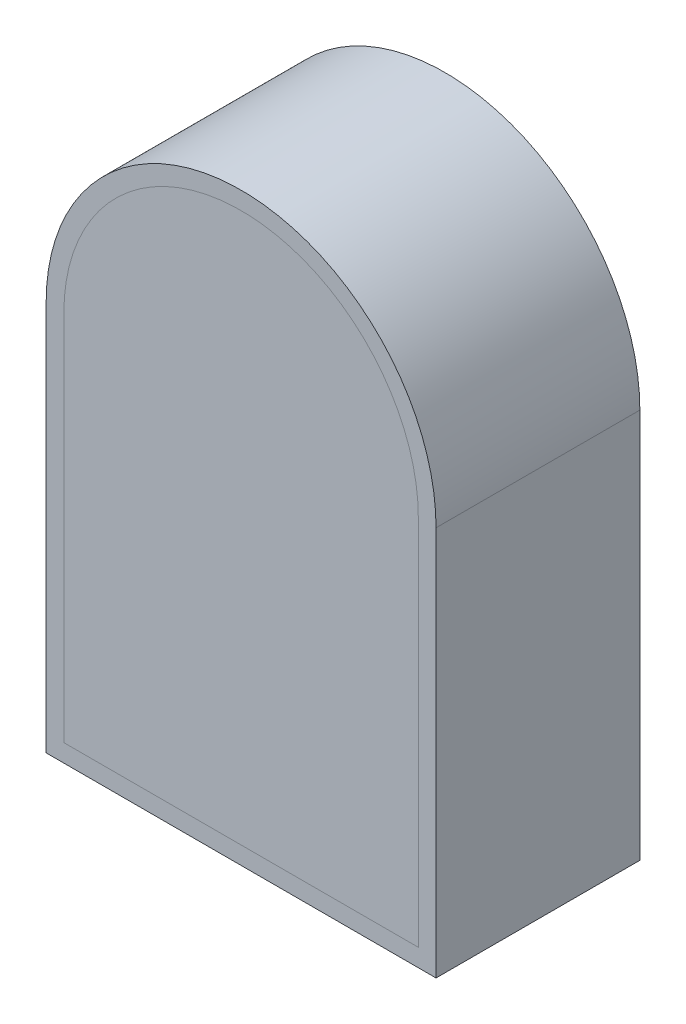
ISO-10303-21;
HEADER;
FILE_DESCRIPTION(('STEP AP214'),'2;1');
FILE_NAME('part.step','',(''),(''),'','','');
FILE_SCHEMA(('AUTOMOTIVE_DESIGN { 1 0 10303 214 1 1 1 1 }'));
ENDSEC;
DATA;
#1=APPLICATION_CONTEXT('core data for automotive mechanical design processes');
#2=APPLICATION_PROTOCOL_DEFINITION('international standard','automotive_design',2000,#1);
#3=PRODUCT_CONTEXT('',#1,'mechanical');
#4=PRODUCT('Part','Part','',(#3));
#5=PRODUCT_RELATED_PRODUCT_CATEGORY('part','',(#4));
#6=PRODUCT_DEFINITION_FORMATION('','',#4);
#7=PRODUCT_DEFINITION_CONTEXT('part definition',#1,'design');
#8=PRODUCT_DEFINITION('design','',#6,#7);
#9=PRODUCT_DEFINITION_SHAPE('','',#8);
#10=(LENGTH_UNIT() NAMED_UNIT(*) SI_UNIT(.MILLI.,.METRE.));
#11=(NAMED_UNIT(*) PLANE_ANGLE_UNIT() SI_UNIT($,.RADIAN.));
#12=(NAMED_UNIT(*) SI_UNIT($,.STERADIAN.) SOLID_ANGLE_UNIT());
#13=UNCERTAINTY_MEASURE_WITH_UNIT(LENGTH_MEASURE(1.E-05),#10,'distance_accuracy_value','');
#14=(GEOMETRIC_REPRESENTATION_CONTEXT(3) GLOBAL_UNCERTAINTY_ASSIGNED_CONTEXT((#13)) GLOBAL_UNIT_ASSIGNED_CONTEXT((#10,
#11,#12)) REPRESENTATION_CONTEXT('',''));
#15=CARTESIAN_POINT('',(0.,0.,0.));
#16=DIRECTION('',(0.,0.,1.));
#17=DIRECTION('',(1.,0.,0.));
#18=AXIS2_PLACEMENT_3D('',#15,#16,#17);
#19=CARTESIAN_POINT('',(10.,22.,11.5));
#20=DIRECTION('',(0.,0.,1.));
#21=DIRECTION('',(-1.,0.,0.));
#22=AXIS2_PLACEMENT_3D('',#19,#20,#21);
#23=PLANE('',#22);
#24=CARTESIAN_POINT('',(0.,22.,11.5));
#25=DIRECTION('',(0.,0.,1.));
#26=DIRECTION('',(1.,0.,0.));
#27=AXIS2_PLACEMENT_3D('',#24,#25,#26);
#28=CIRCLE('',#27,10.);
#29=CARTESIAN_POINT('',(10.,22.,11.5));
#30=VERTEX_POINT('',#29);
#31=CARTESIAN_POINT('',(-10.,22.,11.5));
#32=VERTEX_POINT('',#31);
#33=EDGE_CURVE('E13',#30,#32,#28,.T.);
#34=ORIENTED_EDGE('',*,*,#33,.T.);
#35=DIRECTION('',(0.,-1.,0.));
#36=VECTOR('',#35,1.);
#37=CARTESIAN_POINT('',(-10.,11.5,11.5));
#38=LINE('',#37,#36);
#39=CARTESIAN_POINT('',(-10.,1.,11.5));
#40=VERTEX_POINT('',#39);
#41=EDGE_CURVE('E76',#32,#40,#38,.T.);
#42=ORIENTED_EDGE('',*,*,#41,.T.);
#43=DIRECTION('',(1.,0.,0.));
#44=VECTOR('',#43,1.);
#45=CARTESIAN_POINT('',(0.,1.,11.5));
#46=LINE('',#45,#44);
#47=CARTESIAN_POINT('',(10.,1.,11.5));
#48=VERTEX_POINT('',#47);
#49=EDGE_CURVE('E84',#40,#48,#46,.T.);
#50=ORIENTED_EDGE('',*,*,#49,.T.);
#51=DIRECTION('',(0.,1.,0.));
#52=VECTOR('',#51,1.);
#53=CARTESIAN_POINT('',(10.,11.5,11.5));
#54=LINE('',#53,#52);
#55=EDGE_CURVE('E70',#48,#30,#54,.T.);
#56=ORIENTED_EDGE('',*,*,#55,.T.);
#57=EDGE_LOOP('',(#34,#42,#50,#56));
#58=FACE_BOUND('',#57,.T.);
#59=ADVANCED_FACE('F69',(#58),#23,.T.);
#60=OPEN_SHELL('',(#59));
#61=SHELL_BASED_SURFACE_MODEL('B2',(#60));
#62=CARTESIAN_POINT('',(11.,0.,11.5));
#63=DIRECTION('',(-1.,0.,0.));
#64=DIRECTION('',(0.,0.,1.));
#65=AXIS2_PLACEMENT_3D('',#62,#63,#64);
#66=PLANE('',#65);
#67=DIRECTION('',(0.,1.,0.));
#68=VECTOR('',#67,1.);
#69=CARTESIAN_POINT('',(11.,0.,0.));
#70=LINE('',#69,#68);
#71=CARTESIAN_POINT('',(11.,0.,0.));
#72=VERTEX_POINT('',#71);
#73=CARTESIAN_POINT('',(11.,22.,0.));
#74=VERTEX_POINT('',#73);
#75=EDGE_CURVE('E230',#72,#74,#70,.T.);
#76=ORIENTED_EDGE('',*,*,#75,.T.);
#77=DIRECTION('',(0.,0.,-1.));
#78=VECTOR('',#77,1.);
#79=CARTESIAN_POINT('',(11.,22.,11.5));
#80=LINE('',#79,#78);
#81=CARTESIAN_POINT('',(11.,22.,11.5));
#82=VERTEX_POINT('',#81);
#83=EDGE_CURVE('E67',#82,#74,#80,.T.);
#84=ORIENTED_EDGE('',*,*,#83,.F.);
#85=DIRECTION('',(0.,1.,0.));
#86=VECTOR('',#85,1.);
#87=CARTESIAN_POINT('',(11.,0.,11.5));
#88=LINE('',#87,#86);
#89=CARTESIAN_POINT('',(11.,0.,11.5));
#90=VERTEX_POINT('',#89);
#91=EDGE_CURVE('E236',#90,#82,#88,.T.);
#92=ORIENTED_EDGE('',*,*,#91,.F.);
#93=DIRECTION('',(0.,0.,-1.));
#94=VECTOR('',#93,1.);
#95=CARTESIAN_POINT('',(11.,0.,11.5));
#96=LINE('',#95,#94);
#97=EDGE_CURVE('E246',#90,#72,#96,.T.);
#98=ORIENTED_EDGE('',*,*,#97,.T.);
#99=EDGE_LOOP('',(#76,#84,#92,#98));
#100=FACE_BOUND('',#99,.T.);
#101=ADVANCED_FACE('F111',(#100),#66,.F.);
#102=CARTESIAN_POINT('',(0.,22.,11.5));
#103=DIRECTION('',(0.,0.,-1.));
#104=DIRECTION('',(-1.,0.,0.));
#105=AXIS2_PLACEMENT_3D('',#102,#103,#104);
#106=CYLINDRICAL_SURFACE('',#105,11.);
#107=CARTESIAN_POINT('',(0.,22.,0.));
#108=DIRECTION('',(0.,0.,1.));
#109=DIRECTION('',(1.,0.,0.));
#110=AXIS2_PLACEMENT_3D('',#107,#108,#109);
#111=CIRCLE('',#110,11.);
#112=CARTESIAN_POINT('',(-11.,22.,0.));
#113=VERTEX_POINT('',#112);
#114=EDGE_CURVE('E250',#74,#113,#111,.T.);
#115=ORIENTED_EDGE('',*,*,#114,.T.);
#116=DIRECTION('',(0.,0.,-1.));
#117=VECTOR('',#116,1.);
#118=CARTESIAN_POINT('',(-11.,22.,11.5));
#119=LINE('',#118,#117);
#120=CARTESIAN_POINT('',(-11.,22.,11.5));
#121=VERTEX_POINT('',#120);
#122=EDGE_CURVE('E119',#121,#113,#119,.T.);
#123=ORIENTED_EDGE('',*,*,#122,.F.);
#124=CARTESIAN_POINT('',(0.,22.,11.5));
#125=DIRECTION('',(0.,0.,1.));
#126=DIRECTION('',(1.,0.,0.));
#127=AXIS2_PLACEMENT_3D('',#124,#125,#126);
#128=CIRCLE('',#127,11.);
#129=EDGE_CURVE('E163',#82,#121,#128,.T.);
#130=ORIENTED_EDGE('',*,*,#129,.F.);
#131=ORIENTED_EDGE('',*,*,#83,.T.);
#132=EDGE_LOOP('',(#115,#123,#130,#131));
#133=FACE_BOUND('',#132,.T.);
#134=ADVANCED_FACE('F286',(#133),#106,.T.);
#135=CARTESIAN_POINT('',(-11.,0.,11.5));
#136=DIRECTION('',(1.,0.,0.));
#137=DIRECTION('',(0.,0.,-1.));
#138=AXIS2_PLACEMENT_3D('',#135,#136,#137);
#139=PLANE('',#138);
#140=DIRECTION('',(0.,-1.,0.));
#141=VECTOR('',#140,1.);
#142=CARTESIAN_POINT('',(-11.,0.,0.));
#143=LINE('',#142,#141);
#144=CARTESIAN_POINT('',(-11.,0.,0.));
#145=VERTEX_POINT('',#144);
#146=EDGE_CURVE('E253',#113,#145,#143,.T.);
#147=ORIENTED_EDGE('',*,*,#146,.T.);
#148=DIRECTION('',(0.,0.,-1.));
#149=VECTOR('',#148,1.);
#150=CARTESIAN_POINT('',(-11.,0.,11.5));
#151=LINE('',#150,#149);
#152=CARTESIAN_POINT('',(-11.,0.,11.5));
#153=VERTEX_POINT('',#152);
#154=EDGE_CURVE('E260',#153,#145,#151,.T.);
#155=ORIENTED_EDGE('',*,*,#154,.F.);
#156=DIRECTION('',(0.,-1.,0.));
#157=VECTOR('',#156,1.);
#158=CARTESIAN_POINT('',(-11.,0.,11.5));
#159=LINE('',#158,#157);
#160=EDGE_CURVE('E241',#121,#153,#159,.T.);
#161=ORIENTED_EDGE('',*,*,#160,.F.);
#162=ORIENTED_EDGE('',*,*,#122,.T.);
#163=EDGE_LOOP('',(#147,#155,#161,#162));
#164=FACE_BOUND('',#163,.T.);
#165=ADVANCED_FACE('F267',(#164),#139,.F.);
#166=CARTESIAN_POINT('',(-11.,0.,11.5));
#167=DIRECTION('',(0.,1.,0.));
#168=DIRECTION('',(-1.,0.,0.));
#169=AXIS2_PLACEMENT_3D('',#166,#167,#168);
#170=PLANE('',#169);
#171=DIRECTION('',(1.,0.,0.));
#172=VECTOR('',#171,1.);
#173=CARTESIAN_POINT('',(-11.,0.,0.));
#174=LINE('',#173,#172);
#175=EDGE_CURVE('E156',#145,#72,#174,.T.);
#176=ORIENTED_EDGE('',*,*,#175,.T.);
#177=ORIENTED_EDGE('',*,*,#97,.F.);
#178=DIRECTION('',(1.,0.,0.));
#179=VECTOR('',#178,1.);
#180=CARTESIAN_POINT('',(-11.,0.,11.5));
#181=LINE('',#180,#179);
#182=EDGE_CURVE('E135',#153,#90,#181,.T.);
#183=ORIENTED_EDGE('',*,*,#182,.F.);
#184=ORIENTED_EDGE('',*,*,#154,.T.);
#185=EDGE_LOOP('',(#176,#177,#183,#184));
#186=FACE_BOUND('',#185,.T.);
#187=ADVANCED_FACE('F275',(#186),#170,.F.);
#188=CARTESIAN_POINT('',(0.,22.,11.5));
#189=DIRECTION('',(0.,0.,1.));
#190=DIRECTION('',(1.,0.,0.));
#191=AXIS2_PLACEMENT_3D('',#188,#189,#190);
#192=PLANE('',#191);
#193=CARTESIAN_POINT('',(0.,22.,11.5));
#194=DIRECTION('',(0.,0.,1.));
#195=DIRECTION('',(-1.,0.,0.));
#196=AXIS2_PLACEMENT_3D('',#193,#194,#195);
#197=CIRCLE('',#196,10.);
#198=CARTESIAN_POINT('',(10.,22.,11.5));
#199=VERTEX_POINT('',#198);
#200=CARTESIAN_POINT('',(-10.,22.,11.5));
#201=VERTEX_POINT('',#200);
#202=EDGE_CURVE('E126',#199,#201,#197,.T.);
#203=ORIENTED_EDGE('',*,*,#202,.F.);
#204=DIRECTION('',(0.,1.,0.));
#205=VECTOR('',#204,1.);
#206=CARTESIAN_POINT('',(10.,22.,11.5));
#207=LINE('',#206,#205);
#208=CARTESIAN_POINT('',(10.,1.,11.5));
#209=VERTEX_POINT('',#208);
#210=EDGE_CURVE('E208',#209,#199,#207,.T.);
#211=ORIENTED_EDGE('',*,*,#210,.F.);
#212=DIRECTION('',(1.,0.,0.));
#213=VECTOR('',#212,1.);
#214=CARTESIAN_POINT('',(10.,1.,11.5));
#215=LINE('',#214,#213);
#216=CARTESIAN_POINT('',(-10.,1.,11.5));
#217=VERTEX_POINT('',#216);
#218=EDGE_CURVE('E212',#217,#209,#215,.T.);
#219=ORIENTED_EDGE('',*,*,#218,.F.);
#220=DIRECTION('',(0.,-1.,0.));
#221=VECTOR('',#220,1.);
#222=CARTESIAN_POINT('',(-10.,1.,11.5));
#223=LINE('',#222,#221);
#224=EDGE_CURVE('E221',#201,#217,#223,.T.);
#225=ORIENTED_EDGE('',*,*,#224,.F.);
#226=EDGE_LOOP('',(#203,#211,#219,#225));
#227=FACE_BOUND('',#226,.T.);
#228=ORIENTED_EDGE('',*,*,#91,.T.);
#229=ORIENTED_EDGE('',*,*,#129,.T.);
#230=ORIENTED_EDGE('',*,*,#160,.T.);
#231=ORIENTED_EDGE('',*,*,#182,.T.);
#232=EDGE_LOOP('',(#228,#229,#230,#231));
#233=FACE_BOUND('',#232,.T.);
#234=ADVANCED_FACE('F277',(#227,#233),#192,.T.);
#235=CARTESIAN_POINT('',(0.,22.,0.));
#236=DIRECTION('',(0.,0.,1.));
#237=DIRECTION('',(1.,0.,0.));
#238=AXIS2_PLACEMENT_3D('',#235,#236,#237);
#239=PLANE('',#238);
#240=ORIENTED_EDGE('',*,*,#75,.F.);
#241=ORIENTED_EDGE('',*,*,#175,.F.);
#242=ORIENTED_EDGE('',*,*,#146,.F.);
#243=ORIENTED_EDGE('',*,*,#114,.F.);
#244=EDGE_LOOP('',(#240,#241,#242,#243));
#245=FACE_BOUND('',#244,.T.);
#246=ADVANCED_FACE('F271',(#245),#239,.F.);
#247=CARTESIAN_POINT('',(0.,22.,4.));
#248=DIRECTION('',(0.,0.,1.));
#249=DIRECTION('',(1.,0.,0.));
#250=AXIS2_PLACEMENT_3D('',#247,#248,#249);
#251=CYLINDRICAL_SURFACE('',#250,10.);
#252=ORIENTED_EDGE('',*,*,#202,.T.);
#253=DIRECTION('',(0.,0.,1.));
#254=VECTOR('',#253,1.);
#255=CARTESIAN_POINT('',(-10.,22.,4.));
#256=LINE('',#255,#254);
#257=CARTESIAN_POINT('',(-10.,22.,4.));
#258=VERTEX_POINT('',#257);
#259=EDGE_CURVE('E183',#258,#201,#256,.T.);
#260=ORIENTED_EDGE('',*,*,#259,.F.);
#261=CARTESIAN_POINT('',(0.,22.,4.));
#262=DIRECTION('',(0.,0.,1.));
#263=DIRECTION('',(-1.,0.,0.));
#264=AXIS2_PLACEMENT_3D('',#261,#262,#263);
#265=CIRCLE('',#264,10.);
#266=CARTESIAN_POINT('',(10.,22.,4.));
#267=VERTEX_POINT('',#266);
#268=EDGE_CURVE('E187',#267,#258,#265,.T.);
#269=ORIENTED_EDGE('',*,*,#268,.F.);
#270=DIRECTION('',(0.,0.,1.));
#271=VECTOR('',#270,1.);
#272=CARTESIAN_POINT('',(10.,22.,4.));
#273=LINE('',#272,#271);
#274=EDGE_CURVE('E227',#267,#199,#273,.T.);
#275=ORIENTED_EDGE('',*,*,#274,.T.);
#276=EDGE_LOOP('',(#252,#260,#269,#275));
#277=FACE_BOUND('',#276,.T.);
#278=ADVANCED_FACE('F185',(#277),#251,.F.);
#279=CARTESIAN_POINT('',(10.,22.,4.));
#280=DIRECTION('',(1.,0.,0.));
#281=DIRECTION('',(0.,0.,-1.));
#282=AXIS2_PLACEMENT_3D('',#279,#280,#281);
#283=PLANE('',#282);
#284=ORIENTED_EDGE('',*,*,#210,.T.);
#285=ORIENTED_EDGE('',*,*,#274,.F.);
#286=DIRECTION('',(0.,1.,0.));
#287=VECTOR('',#286,1.);
#288=CARTESIAN_POINT('',(10.,22.,4.));
#289=LINE('',#288,#287);
#290=CARTESIAN_POINT('',(10.,1.,4.));
#291=VERTEX_POINT('',#290);
#292=EDGE_CURVE('E194',#291,#267,#289,.T.);
#293=ORIENTED_EDGE('',*,*,#292,.F.);
#294=DIRECTION('',(0.,0.,1.));
#295=VECTOR('',#294,1.);
#296=CARTESIAN_POINT('',(10.,1.,4.));
#297=LINE('',#296,#295);
#298=EDGE_CURVE('E231',#291,#209,#297,.T.);
#299=ORIENTED_EDGE('',*,*,#298,.T.);
#300=EDGE_LOOP('',(#284,#285,#293,#299));
#301=FACE_BOUND('',#300,.T.);
#302=ADVANCED_FACE('F326',(#301),#283,.F.);
#303=CARTESIAN_POINT('',(10.,1.,4.));
#304=DIRECTION('',(0.,-1.,0.));
#305=DIRECTION('',(0.,0.,-1.));
#306=AXIS2_PLACEMENT_3D('',#303,#304,#305);
#307=PLANE('',#306);
#308=ORIENTED_EDGE('',*,*,#218,.T.);
#309=ORIENTED_EDGE('',*,*,#298,.F.);
#310=DIRECTION('',(1.,0.,0.));
#311=VECTOR('',#310,1.);
#312=CARTESIAN_POINT('',(10.,1.,4.));
#313=LINE('',#312,#311);
#314=CARTESIAN_POINT('',(-10.,1.,4.));
#315=VERTEX_POINT('',#314);
#316=EDGE_CURVE('E203',#315,#291,#313,.T.);
#317=ORIENTED_EDGE('',*,*,#316,.F.);
#318=DIRECTION('',(0.,0.,1.));
#319=VECTOR('',#318,1.);
#320=CARTESIAN_POINT('',(-10.,1.,4.));
#321=LINE('',#320,#319);
#322=EDGE_CURVE('E193',#315,#217,#321,.T.);
#323=ORIENTED_EDGE('',*,*,#322,.T.);
#324=EDGE_LOOP('',(#308,#309,#317,#323));
#325=FACE_BOUND('',#324,.T.);
#326=ADVANCED_FACE('F335',(#325),#307,.F.);
#327=CARTESIAN_POINT('',(-10.,1.,4.));
#328=DIRECTION('',(-1.,0.,0.));
#329=DIRECTION('',(0.,0.,1.));
#330=AXIS2_PLACEMENT_3D('',#327,#328,#329);
#331=PLANE('',#330);
#332=ORIENTED_EDGE('',*,*,#224,.T.);
#333=ORIENTED_EDGE('',*,*,#322,.F.);
#334=DIRECTION('',(0.,-1.,0.));
#335=VECTOR('',#334,1.);
#336=CARTESIAN_POINT('',(-10.,1.,4.));
#337=LINE('',#336,#335);
#338=EDGE_CURVE('E197',#258,#315,#337,.T.);
#339=ORIENTED_EDGE('',*,*,#338,.F.);
#340=ORIENTED_EDGE('',*,*,#259,.T.);
#341=EDGE_LOOP('',(#332,#333,#339,#340));
#342=FACE_BOUND('',#341,.T.);
#343=ADVANCED_FACE('F198',(#342),#331,.F.);
#344=CARTESIAN_POINT('',(0.,22.,4.));
#345=DIRECTION('',(0.,0.,-1.));
#346=DIRECTION('',(-1.,0.,0.));
#347=AXIS2_PLACEMENT_3D('',#344,#345,#346);
#348=PLANE('',#347);
#349=ORIENTED_EDGE('',*,*,#268,.T.);
#350=ORIENTED_EDGE('',*,*,#338,.T.);
#351=ORIENTED_EDGE('',*,*,#316,.T.);
#352=ORIENTED_EDGE('',*,*,#292,.T.);
#353=EDGE_LOOP('',(#349,#350,#351,#352));
#354=FACE_BOUND('',#353,.T.);
#355=ADVANCED_FACE('F205',(#354),#348,.F.);
#356=CLOSED_SHELL('',(#101,#134,#165,#187,#234,#246,#278,#302,#326,#343,#355));
#357=MANIFOLD_SOLID_BREP('B7',#356);
#358=ADVANCED_BREP_SHAPE_REPRESENTATION('',(#18,#357),#14);
#359=MANIFOLD_SURFACE_SHAPE_REPRESENTATION('',(#18,#61),#14);
#360=SHAPE_REPRESENTATION('',(#18),#14);
#361=SHAPE_DEFINITION_REPRESENTATION(#9,#360);
#362=SHAPE_REPRESENTATION_RELATIONSHIP('','',#360,#358);
#363=SHAPE_REPRESENTATION_RELATIONSHIP('','',#360,#359);
ENDSEC;
END-ISO-10303-21;
